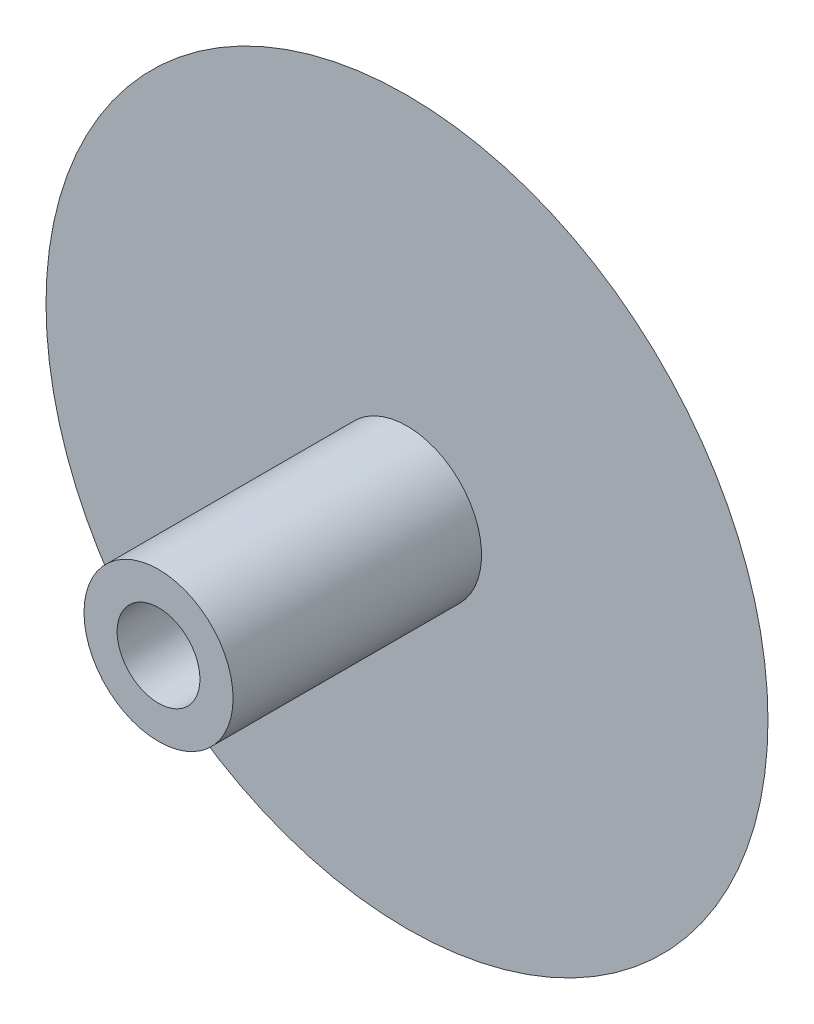
ISO-10303-21;
HEADER;
FILE_DESCRIPTION(('STEP AP214'),'2;1');
FILE_NAME('part.step','',(''),(''),'','','');
FILE_SCHEMA(('AUTOMOTIVE_DESIGN { 1 0 10303 214 1 1 1 1 }'));
ENDSEC;
DATA;
#1=APPLICATION_CONTEXT('core data for automotive mechanical design processes');
#2=APPLICATION_PROTOCOL_DEFINITION('international standard','automotive_design',2000,#1);
#3=PRODUCT_CONTEXT('',#1,'mechanical');
#4=PRODUCT('Part','Part','',(#3));
#5=PRODUCT_RELATED_PRODUCT_CATEGORY('part','',(#4));
#6=PRODUCT_DEFINITION_FORMATION('','',#4);
#7=PRODUCT_DEFINITION_CONTEXT('part definition',#1,'design');
#8=PRODUCT_DEFINITION('design','',#6,#7);
#9=PRODUCT_DEFINITION_SHAPE('','',#8);
#10=(LENGTH_UNIT() NAMED_UNIT(*) SI_UNIT(.MILLI.,.METRE.));
#11=(NAMED_UNIT(*) PLANE_ANGLE_UNIT() SI_UNIT($,.RADIAN.));
#12=(NAMED_UNIT(*) SI_UNIT($,.STERADIAN.) SOLID_ANGLE_UNIT());
#13=UNCERTAINTY_MEASURE_WITH_UNIT(LENGTH_MEASURE(1.E-05),#10,'distance_accuracy_value','');
#14=(GEOMETRIC_REPRESENTATION_CONTEXT(3) GLOBAL_UNCERTAINTY_ASSIGNED_CONTEXT((#13)) GLOBAL_UNIT_ASSIGNED_CONTEXT((#10,
#11,#12)) REPRESENTATION_CONTEXT('',''));
#15=CARTESIAN_POINT('',(0.,0.,0.));
#16=DIRECTION('',(0.,0.,1.));
#17=DIRECTION('',(1.,0.,0.));
#18=AXIS2_PLACEMENT_3D('',#15,#16,#17);
#19=CARTESIAN_POINT('',(21.7944947177034,0.,-45.));
#20=DIRECTION('',(0.,0.,-1.));
#21=DIRECTION('',(-1.,0.,0.));
#22=AXIS2_PLACEMENT_3D('',#19,#20,#21);
#23=PLANE('',#22);
#24=CARTESIAN_POINT('',(0.,0.,-45.));
#25=DIRECTION('',(0.,0.,-1.));
#26=DIRECTION('',(-1.,0.,0.));
#27=AXIS2_PLACEMENT_3D('',#24,#25,#26);
#28=CIRCLE('',#27,21.7944947177034);
#29=CARTESIAN_POINT('',(-21.7944947177034,0.,-45.));
#30=VERTEX_POINT('',#29);
#31=EDGE_CURVE('E38',#30,#30,#28,.T.);
#32=ORIENTED_EDGE('',*,*,#31,.F.);
#33=EDGE_LOOP('',(#32));
#34=FACE_BOUND('',#33,.T.);
#35=CARTESIAN_POINT('',(0.,0.,-45.));
#36=DIRECTION('',(0.,0.,-1.));
#37=DIRECTION('',(-1.,0.,0.));
#38=AXIS2_PLACEMENT_3D('',#35,#36,#37);
#39=CIRCLE('',#38,4.5);
#40=CARTESIAN_POINT('',(-4.5,0.,-45.));
#41=VERTEX_POINT('',#40);
#42=EDGE_CURVE('E10',#41,#41,#39,.F.);
#43=ORIENTED_EDGE('',*,*,#42,.F.);
#44=EDGE_LOOP('',(#43));
#45=FACE_BOUND('',#44,.T.);
#46=ADVANCED_FACE('F31',(#34,#45),#23,.F.);
#47=CARTESIAN_POINT('',(0.,0.,0.));
#48=DIRECTION('',(0.,0.,-1.));
#49=DIRECTION('',(1.,0.,0.));
#50=AXIS2_PLACEMENT_3D('',#47,#48,#49);
#51=SPHERICAL_SURFACE('',#50,50.);
#52=ORIENTED_EDGE('',*,*,#31,.T.);
#53=EDGE_LOOP('',(#52));
#54=FACE_BOUND('',#53,.T.);
#55=ADVANCED_FACE('F33',(#54),#51,.T.);
#56=CARTESIAN_POINT('',(0.,0.,-30.));
#57=DIRECTION('',(0.,0.,1.));
#58=DIRECTION('',(1.,0.,0.));
#59=AXIS2_PLACEMENT_3D('',#56,#57,#58);
#60=PLANE('',#59);
#61=CARTESIAN_POINT('',(0.,0.,-30.));
#62=DIRECTION('',(0.,0.,1.));
#63=DIRECTION('',(1.,0.,0.));
#64=AXIS2_PLACEMENT_3D('',#61,#62,#63);
#65=CIRCLE('',#64,4.5);
#66=CARTESIAN_POINT('',(4.5,0.,-30.));
#67=VERTEX_POINT('',#66);
#68=EDGE_CURVE('E42',#67,#67,#65,.T.);
#69=ORIENTED_EDGE('',*,*,#68,.T.);
#70=EDGE_LOOP('',(#69));
#71=FACE_BOUND('',#70,.T.);
#72=CARTESIAN_POINT('',(0.,0.,-30.));
#73=DIRECTION('',(0.,0.,1.));
#74=DIRECTION('',(1.,0.,0.));
#75=AXIS2_PLACEMENT_3D('',#72,#73,#74);
#76=CIRCLE('',#75,2.5);
#77=CARTESIAN_POINT('',(2.5,0.,-30.));
#78=VERTEX_POINT('',#77);
#79=EDGE_CURVE('E46',#78,#78,#76,.T.);
#80=ORIENTED_EDGE('',*,*,#79,.F.);
#81=EDGE_LOOP('',(#80));
#82=FACE_BOUND('',#81,.T.);
#83=ADVANCED_FACE('F58',(#71,#82),#60,.T.);
#84=CARTESIAN_POINT('',(0.,0.,-30.));
#85=DIRECTION('',(0.,0.,-1.));
#86=DIRECTION('',(-1.,0.,0.));
#87=AXIS2_PLACEMENT_3D('',#84,#85,#86);
#88=CYLINDRICAL_SURFACE('',#87,4.5);
#89=ORIENTED_EDGE('',*,*,#68,.F.);
#90=EDGE_LOOP('',(#89));
#91=FACE_BOUND('',#90,.T.);
#92=ORIENTED_EDGE('',*,*,#42,.T.);
#93=EDGE_LOOP('',(#92));
#94=FACE_BOUND('',#93,.T.);
#95=ADVANCED_FACE('F60',(#91,#94),#88,.T.);
#96=CARTESIAN_POINT('',(0.,0.,-30.));
#97=DIRECTION('',(0.,0.,-1.));
#98=DIRECTION('',(-1.,0.,0.));
#99=AXIS2_PLACEMENT_3D('',#96,#97,#98);
#100=CYLINDRICAL_SURFACE('',#99,2.5);
#101=ORIENTED_EDGE('',*,*,#79,.T.);
#102=EDGE_LOOP('',(#101));
#103=FACE_BOUND('',#102,.T.);
#104=CARTESIAN_POINT('',(0.,0.,-45.));
#105=DIRECTION('',(0.,0.,1.));
#106=DIRECTION('',(1.,0.,0.));
#107=AXIS2_PLACEMENT_3D('',#104,#105,#106);
#108=CIRCLE('',#107,2.5);
#109=CARTESIAN_POINT('',(2.5,0.,-45.));
#110=VERTEX_POINT('',#109);
#111=EDGE_CURVE('E49',#110,#110,#108,.T.);
#112=ORIENTED_EDGE('',*,*,#111,.F.);
#113=EDGE_LOOP('',(#112));
#114=FACE_BOUND('',#113,.T.);
#115=ADVANCED_FACE('F55',(#103,#114),#100,.F.);
#116=ORIENTED_EDGE('',*,*,#111,.T.);
#117=EDGE_LOOP('',(#116));
#118=FACE_BOUND('',#117,.T.);
#119=ADVANCED_FACE('F72',(#118),#23,.F.);
#120=CLOSED_SHELL('',(#46,#55,#83,#95,#115,#119));
#121=MANIFOLD_SOLID_BREP('B2',#120);
#122=ADVANCED_BREP_SHAPE_REPRESENTATION('',(#18,#121),#14);
#123=SHAPE_DEFINITION_REPRESENTATION(#9,#122);
ENDSEC;
END-ISO-10303-21;
